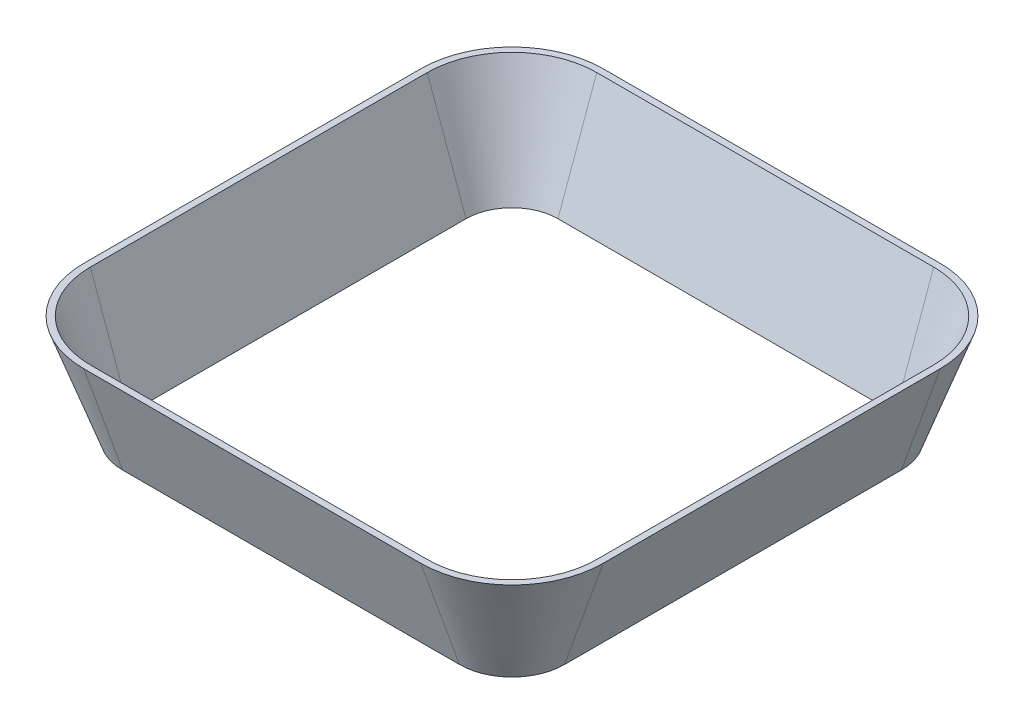
ISO-10303-21;
HEADER;
FILE_DESCRIPTION(('STEP AP214'),'2;1');
FILE_NAME('part.step','',(''),(''),'','','');
FILE_SCHEMA(('AUTOMOTIVE_DESIGN { 1 0 10303 214 1 1 1 1 }'));
ENDSEC;
DATA;
#1=APPLICATION_CONTEXT('core data for automotive mechanical design processes');
#2=APPLICATION_PROTOCOL_DEFINITION('international standard','automotive_design',2000,#1);
#3=PRODUCT_CONTEXT('',#1,'mechanical');
#4=PRODUCT('Part','Part','',(#3));
#5=PRODUCT_RELATED_PRODUCT_CATEGORY('part','',(#4));
#6=PRODUCT_DEFINITION_FORMATION('','',#4);
#7=PRODUCT_DEFINITION_CONTEXT('part definition',#1,'design');
#8=PRODUCT_DEFINITION('design','',#6,#7);
#9=PRODUCT_DEFINITION_SHAPE('','',#8);
#10=(LENGTH_UNIT() NAMED_UNIT(*) SI_UNIT(.MILLI.,.METRE.));
#11=(NAMED_UNIT(*) PLANE_ANGLE_UNIT() SI_UNIT($,.RADIAN.));
#12=(NAMED_UNIT(*) SI_UNIT($,.STERADIAN.) SOLID_ANGLE_UNIT());
#13=UNCERTAINTY_MEASURE_WITH_UNIT(LENGTH_MEASURE(1.E-05),#10,'distance_accuracy_value','');
#14=(GEOMETRIC_REPRESENTATION_CONTEXT(3) GLOBAL_UNCERTAINTY_ASSIGNED_CONTEXT((#13)) GLOBAL_UNIT_ASSIGNED_CONTEXT((#10,
#11,#12)) REPRESENTATION_CONTEXT('',''));
#15=CARTESIAN_POINT('',(0.,0.,0.));
#16=DIRECTION('',(0.,0.,1.));
#17=DIRECTION('',(1.,0.,0.));
#18=AXIS2_PLACEMENT_3D('',#15,#16,#17);
#19=CARTESIAN_POINT('',(-55.,35.,55.));
#20=DIRECTION('',(0.,1.,0.));
#21=DIRECTION('',(0.,0.,1.));
#22=AXIS2_PLACEMENT_3D('',#19,#20,#21);
#23=PLANE('',#22);
#24=CARTESIAN_POINT('',(-55.,35.,55.));
#25=DIRECTION('',(0.,1.,0.));
#26=DIRECTION('',(0.,0.,1.));
#27=AXIS2_PLACEMENT_3D('',#24,#25,#26);
#28=CIRCLE('',#27,27.6729319184893);
#29=CARTESIAN_POINT('',(-82.6729319184893,35.,55.));
#30=VERTEX_POINT('',#29);
#31=CARTESIAN_POINT('',(-55.,35.,82.6729319184893));
#32=VERTEX_POINT('',#31);
#33=EDGE_CURVE('E221',#30,#32,#28,.T.);
#34=ORIENTED_EDGE('',*,*,#33,.F.);
#35=DIRECTION('',(0.,0.,1.));
#36=VECTOR('',#35,1.);
#37=CARTESIAN_POINT('',(-82.6729319184893,35.,0.));
#38=LINE('',#37,#36);
#39=CARTESIAN_POINT('',(-82.6729319184893,35.,-55.0000000000001));
#40=VERTEX_POINT('',#39);
#41=EDGE_CURVE('E206',#40,#30,#38,.T.);
#42=ORIENTED_EDGE('',*,*,#41,.F.);
#43=CARTESIAN_POINT('',(-55.,35.,-55.));
#44=DIRECTION('',(0.,1.,0.));
#45=DIRECTION('',(0.,0.,1.));
#46=AXIS2_PLACEMENT_3D('',#43,#44,#45);
#47=CIRCLE('',#46,27.6729319184893);
#48=CARTESIAN_POINT('',(-55.,35.,-82.6729319184893));
#49=VERTEX_POINT('',#48);
#50=EDGE_CURVE('E105',#49,#40,#47,.T.);
#51=ORIENTED_EDGE('',*,*,#50,.F.);
#52=DIRECTION('',(-1.,0.,0.));
#53=VECTOR('',#52,1.);
#54=CARTESIAN_POINT('',(0.,35.,-82.6729319184893));
#55=LINE('',#54,#53);
#56=CARTESIAN_POINT('',(55.,35.,-82.6729319184893));
#57=VERTEX_POINT('',#56);
#58=EDGE_CURVE('E255',#57,#49,#55,.T.);
#59=ORIENTED_EDGE('',*,*,#58,.F.);
#60=CARTESIAN_POINT('',(55.,35.,-55.));
#61=DIRECTION('',(0.,1.,0.));
#62=DIRECTION('',(0.,0.,1.));
#63=AXIS2_PLACEMENT_3D('',#60,#61,#62);
#64=CIRCLE('',#63,27.6729319184893);
#65=CARTESIAN_POINT('',(82.6729319184893,35.,-55.));
#66=VERTEX_POINT('',#65);
#67=EDGE_CURVE('E251',#66,#57,#64,.T.);
#68=ORIENTED_EDGE('',*,*,#67,.F.);
#69=DIRECTION('',(0.,0.,-1.));
#70=VECTOR('',#69,1.);
#71=CARTESIAN_POINT('',(82.6729319184893,35.,0.));
#72=LINE('',#71,#70);
#73=CARTESIAN_POINT('',(82.6729319184893,35.,55.));
#74=VERTEX_POINT('',#73);
#75=EDGE_CURVE('E247',#74,#66,#72,.T.);
#76=ORIENTED_EDGE('',*,*,#75,.F.);
#77=CARTESIAN_POINT('',(55.,35.,55.));
#78=DIRECTION('',(0.,1.,0.));
#79=DIRECTION('',(0.,0.,1.));
#80=AXIS2_PLACEMENT_3D('',#77,#78,#79);
#81=CIRCLE('',#80,27.6729319184893);
#82=CARTESIAN_POINT('',(55.,35.,82.6729319184893));
#83=VERTEX_POINT('',#82);
#84=EDGE_CURVE('E238',#83,#74,#81,.T.);
#85=ORIENTED_EDGE('',*,*,#84,.F.);
#86=DIRECTION('',(1.,0.,0.));
#87=VECTOR('',#86,1.);
#88=CARTESIAN_POINT('',(0.,35.,82.6729319184893));
#89=LINE('',#88,#87);
#90=EDGE_CURVE('E232',#32,#83,#89,.T.);
#91=ORIENTED_EDGE('',*,*,#90,.F.);
#92=EDGE_LOOP('',(#34,#42,#51,#59,#68,#76,#85,#91));
#93=FACE_BOUND('',#92,.T.);
#94=CARTESIAN_POINT('',(-55.,35.,55.));
#95=DIRECTION('',(0.,1.,0.));
#96=DIRECTION('',(0.,0.,1.));
#97=AXIS2_PLACEMENT_3D('',#94,#95,#96);
#98=CIRCLE('',#97,29.8);
#99=CARTESIAN_POINT('',(-84.8,35.,55.));
#100=VERTEX_POINT('',#99);
#101=CARTESIAN_POINT('',(-55.,35.,84.8));
#102=VERTEX_POINT('',#101);
#103=EDGE_CURVE('E278',#100,#102,#98,.T.);
#104=ORIENTED_EDGE('',*,*,#103,.T.);
#105=DIRECTION('',(1.,0.,0.));
#106=VECTOR('',#105,1.);
#107=CARTESIAN_POINT('',(-55.,35.,84.8));
#108=LINE('',#107,#106);
#109=CARTESIAN_POINT('',(55.,35.,84.8));
#110=VERTEX_POINT('',#109);
#111=EDGE_CURVE('E338',#102,#110,#108,.T.);
#112=ORIENTED_EDGE('',*,*,#111,.T.);
#113=CARTESIAN_POINT('',(55.,35.,55.));
#114=DIRECTION('',(0.,1.,0.));
#115=DIRECTION('',(0.,0.,1.));
#116=AXIS2_PLACEMENT_3D('',#113,#114,#115);
#117=CIRCLE('',#116,29.8);
#118=CARTESIAN_POINT('',(84.8,35.,55.));
#119=VERTEX_POINT('',#118);
#120=EDGE_CURVE('E336',#110,#119,#117,.T.);
#121=ORIENTED_EDGE('',*,*,#120,.T.);
#122=DIRECTION('',(0.,0.,-1.));
#123=VECTOR('',#122,1.);
#124=CARTESIAN_POINT('',(84.8,35.,55.));
#125=LINE('',#124,#123);
#126=CARTESIAN_POINT('',(84.8,35.,-55.));
#127=VERTEX_POINT('',#126);
#128=EDGE_CURVE('E320',#119,#127,#125,.T.);
#129=ORIENTED_EDGE('',*,*,#128,.T.);
#130=CARTESIAN_POINT('',(55.,35.,-55.));
#131=DIRECTION('',(0.,1.,0.));
#132=DIRECTION('',(0.,0.,1.));
#133=AXIS2_PLACEMENT_3D('',#130,#131,#132);
#134=CIRCLE('',#133,29.8);
#135=CARTESIAN_POINT('',(55.,35.,-84.8));
#136=VERTEX_POINT('',#135);
#137=EDGE_CURVE('E309',#127,#136,#134,.T.);
#138=ORIENTED_EDGE('',*,*,#137,.T.);
#139=DIRECTION('',(-1.,0.,0.));
#140=VECTOR('',#139,1.);
#141=CARTESIAN_POINT('',(55.,35.,-84.8));
#142=LINE('',#141,#140);
#143=CARTESIAN_POINT('',(-55.,35.,-84.8));
#144=VERTEX_POINT('',#143);
#145=EDGE_CURVE('E307',#136,#144,#142,.T.);
#146=ORIENTED_EDGE('',*,*,#145,.T.);
#147=CARTESIAN_POINT('',(-55.,35.,-55.));
#148=DIRECTION('',(0.,1.,0.));
#149=DIRECTION('',(0.,0.,1.));
#150=AXIS2_PLACEMENT_3D('',#147,#148,#149);
#151=CIRCLE('',#150,29.8);
#152=CARTESIAN_POINT('',(-84.8,35.,-55.));
#153=VERTEX_POINT('',#152);
#154=EDGE_CURVE('E97',#144,#153,#151,.T.);
#155=ORIENTED_EDGE('',*,*,#154,.T.);
#156=DIRECTION('',(0.,0.,1.));
#157=VECTOR('',#156,1.);
#158=CARTESIAN_POINT('',(-84.8,35.,-55.));
#159=LINE('',#158,#157);
#160=EDGE_CURVE('E13',#153,#100,#159,.T.);
#161=ORIENTED_EDGE('',*,*,#160,.T.);
#162=EDGE_LOOP('',(#104,#112,#121,#129,#138,#146,#155,#161));
#163=FACE_BOUND('',#162,.T.);
#164=ADVANCED_FACE('F86',(#93,#163),#23,.T.);
#165=CARTESIAN_POINT('',(-55.,0.,55.));
#166=DIRECTION('',(0.,1.,0.));
#167=DIRECTION('',(0.,0.,1.));
#168=AXIS2_PLACEMENT_3D('',#165,#166,#167);
#169=PLANE('',#168);
#170=DIRECTION('',(0.,0.,1.));
#171=VECTOR('',#170,1.);
#172=CARTESIAN_POINT('',(-70.,0.,0.));
#173=LINE('',#172,#171);
#174=CARTESIAN_POINT('',(-70.,0.,-55.));
#175=VERTEX_POINT('',#174);
#176=CARTESIAN_POINT('',(-70.,0.,55.));
#177=VERTEX_POINT('',#176);
#178=EDGE_CURVE('E264',#175,#177,#173,.T.);
#179=ORIENTED_EDGE('',*,*,#178,.T.);
#180=CARTESIAN_POINT('',(-55.,0.,55.));
#181=DIRECTION('',(0.,1.,0.));
#182=DIRECTION('',(0.,0.,1.));
#183=AXIS2_PLACEMENT_3D('',#180,#181,#182);
#184=CIRCLE('',#183,15.);
#185=CARTESIAN_POINT('',(-55.,0.,70.));
#186=VERTEX_POINT('',#185);
#187=EDGE_CURVE('E224',#177,#186,#184,.T.);
#188=ORIENTED_EDGE('',*,*,#187,.T.);
#189=DIRECTION('',(1.,0.,0.));
#190=VECTOR('',#189,1.);
#191=CARTESIAN_POINT('',(0.,0.,70.));
#192=LINE('',#191,#190);
#193=CARTESIAN_POINT('',(55.,0.,70.));
#194=VERTEX_POINT('',#193);
#195=EDGE_CURVE('E672',#186,#194,#192,.T.);
#196=ORIENTED_EDGE('',*,*,#195,.T.);
#197=CARTESIAN_POINT('',(55.,0.,55.));
#198=DIRECTION('',(0.,1.,0.));
#199=DIRECTION('',(0.,0.,1.));
#200=AXIS2_PLACEMENT_3D('',#197,#198,#199);
#201=CIRCLE('',#200,15.);
#202=CARTESIAN_POINT('',(70.,0.,55.));
#203=VERTEX_POINT('',#202);
#204=EDGE_CURVE('E676',#194,#203,#201,.T.);
#205=ORIENTED_EDGE('',*,*,#204,.T.);
#206=DIRECTION('',(0.,0.,-1.));
#207=VECTOR('',#206,1.);
#208=CARTESIAN_POINT('',(70.,0.,0.));
#209=LINE('',#208,#207);
#210=CARTESIAN_POINT('',(70.,0.,-55.));
#211=VERTEX_POINT('',#210);
#212=EDGE_CURVE('E681',#203,#211,#209,.T.);
#213=ORIENTED_EDGE('',*,*,#212,.T.);
#214=CARTESIAN_POINT('',(55.,0.,-55.));
#215=DIRECTION('',(0.,1.,0.));
#216=DIRECTION('',(0.,0.,1.));
#217=AXIS2_PLACEMENT_3D('',#214,#215,#216);
#218=CIRCLE('',#217,15.);
#219=CARTESIAN_POINT('',(55.,0.,-70.));
#220=VERTEX_POINT('',#219);
#221=EDGE_CURVE('E685',#211,#220,#218,.T.);
#222=ORIENTED_EDGE('',*,*,#221,.T.);
#223=DIRECTION('',(-1.,0.,0.));
#224=VECTOR('',#223,1.);
#225=CARTESIAN_POINT('',(0.,0.,-70.));
#226=LINE('',#225,#224);
#227=CARTESIAN_POINT('',(-55.,0.,-70.));
#228=VERTEX_POINT('',#227);
#229=EDGE_CURVE('E265',#220,#228,#226,.T.);
#230=ORIENTED_EDGE('',*,*,#229,.T.);
#231=CARTESIAN_POINT('',(-55.,0.,-55.));
#232=DIRECTION('',(0.,1.,0.));
#233=DIRECTION('',(0.,0.,1.));
#234=AXIS2_PLACEMENT_3D('',#231,#232,#233);
#235=CIRCLE('',#234,15.);
#236=EDGE_CURVE('E259',#228,#175,#235,.T.);
#237=ORIENTED_EDGE('',*,*,#236,.T.);
#238=EDGE_LOOP('',(#179,#188,#196,#205,#213,#222,#230,#237));
#239=FACE_BOUND('',#238,.T.);
#240=CARTESIAN_POINT('',(-55.,0.,55.));
#241=DIRECTION('',(0.,1.,0.));
#242=DIRECTION('',(0.,0.,1.));
#243=AXIS2_PLACEMENT_3D('',#240,#241,#242);
#244=CIRCLE('',#243,17.1270680815107);
#245=CARTESIAN_POINT('',(-72.1270680815107,0.,55.));
#246=VERTEX_POINT('',#245);
#247=CARTESIAN_POINT('',(-55.,0.,72.1270680815107));
#248=VERTEX_POINT('',#247);
#249=EDGE_CURVE('E215',#246,#248,#244,.T.);
#250=ORIENTED_EDGE('',*,*,#249,.F.);
#251=DIRECTION('',(0.,0.,1.));
#252=VECTOR('',#251,1.);
#253=CARTESIAN_POINT('',(-72.1270680815107,0.,-55.));
#254=LINE('',#253,#252);
#255=CARTESIAN_POINT('',(-72.1270680815107,0.,-55.));
#256=VERTEX_POINT('',#255);
#257=EDGE_CURVE('E430',#256,#246,#254,.T.);
#258=ORIENTED_EDGE('',*,*,#257,.F.);
#259=CARTESIAN_POINT('',(-55.,0.,-55.));
#260=DIRECTION('',(0.,1.,0.));
#261=DIRECTION('',(0.,0.,1.));
#262=AXIS2_PLACEMENT_3D('',#259,#260,#261);
#263=CIRCLE('',#262,17.1270680815107);
#264=CARTESIAN_POINT('',(-55.,0.,-72.1270680815107));
#265=VERTEX_POINT('',#264);
#266=EDGE_CURVE('E436',#265,#256,#263,.T.);
#267=ORIENTED_EDGE('',*,*,#266,.F.);
#268=DIRECTION('',(-1.,0.,0.));
#269=VECTOR('',#268,1.);
#270=CARTESIAN_POINT('',(55.,0.,-72.1270680815107));
#271=LINE('',#270,#269);
#272=CARTESIAN_POINT('',(55.,0.,-72.1270680815107));
#273=VERTEX_POINT('',#272);
#274=EDGE_CURVE('E380',#273,#265,#271,.T.);
#275=ORIENTED_EDGE('',*,*,#274,.F.);
#276=CARTESIAN_POINT('',(55.,0.,-55.));
#277=DIRECTION('',(0.,1.,0.));
#278=DIRECTION('',(0.,0.,1.));
#279=AXIS2_PLACEMENT_3D('',#276,#277,#278);
#280=CIRCLE('',#279,17.1270680815107);
#281=CARTESIAN_POINT('',(72.1270680815107,0.,-55.));
#282=VERTEX_POINT('',#281);
#283=EDGE_CURVE('E513',#282,#273,#280,.T.);
#284=ORIENTED_EDGE('',*,*,#283,.F.);
#285=DIRECTION('',(0.,0.,-1.));
#286=VECTOR('',#285,1.);
#287=CARTESIAN_POINT('',(72.1270680815107,0.,55.));
#288=LINE('',#287,#286);
#289=CARTESIAN_POINT('',(72.1270680815107,0.,55.));
#290=VERTEX_POINT('',#289);
#291=EDGE_CURVE('E508',#290,#282,#288,.T.);
#292=ORIENTED_EDGE('',*,*,#291,.F.);
#293=CARTESIAN_POINT('',(55.,0.,55.));
#294=DIRECTION('',(0.,1.,0.));
#295=DIRECTION('',(0.,0.,1.));
#296=AXIS2_PLACEMENT_3D('',#293,#294,#295);
#297=CIRCLE('',#296,17.1270680815107);
#298=CARTESIAN_POINT('',(55.,0.,72.1270680815107));
#299=VERTEX_POINT('',#298);
#300=EDGE_CURVE('E503',#299,#290,#297,.T.);
#301=ORIENTED_EDGE('',*,*,#300,.F.);
#302=DIRECTION('',(1.,0.,0.));
#303=VECTOR('',#302,1.);
#304=CARTESIAN_POINT('',(-55.,0.,72.1270680815107));
#305=LINE('',#304,#303);
#306=EDGE_CURVE('E495',#248,#299,#305,.T.);
#307=ORIENTED_EDGE('',*,*,#306,.F.);
#308=EDGE_LOOP('',(#250,#258,#267,#275,#284,#292,#301,#307));
#309=FACE_BOUND('',#308,.T.);
#310=ADVANCED_FACE('F447',(#239,#309),#169,.F.);
#311=CARTESIAN_POINT('',(-55.,0.,-55.));
#312=DIRECTION('',(0.,1.,0.));
#313=DIRECTION('',(0.,0.,1.));
#314=AXIS2_PLACEMENT_3D('',#311,#312,#313);
#315=CONICAL_SURFACE('',#314,17.1270680815107,0.347399050701601);
#316=DIRECTION('',(-0.340453389571364,0.940261394256602,0.));
#317=VECTOR('',#316,1.);
#318=CARTESIAN_POINT('',(-72.1270680815107,0.,-55.));
#319=LINE('',#318,#317);
#320=EDGE_CURVE('E435',#256,#153,#319,.T.);
#321=ORIENTED_EDGE('',*,*,#320,.T.);
#322=ORIENTED_EDGE('',*,*,#154,.F.);
#323=DIRECTION('',(0.,0.940261394256602,-0.340453389571364));
#324=VECTOR('',#323,1.);
#325=CARTESIAN_POINT('',(-55.,0.,-72.1270680815107));
#326=LINE('',#325,#324);
#327=EDGE_CURVE('E386',#265,#144,#326,.T.);
#328=ORIENTED_EDGE('',*,*,#327,.F.);
#329=ORIENTED_EDGE('',*,*,#266,.T.);
#330=EDGE_LOOP('',(#321,#322,#328,#329));
#331=FACE_BOUND('',#330,.T.);
#332=ADVANCED_FACE('F399',(#331),#315,.T.);
#333=CARTESIAN_POINT('',(0.,-23.0889692921857,-63.766927055569));
#334=DIRECTION('',(0.,0.340453389571364,0.940261394256602));
#335=DIRECTION('',(0.,-0.940261394256602,0.340453389571364));
#336=AXIS2_PLACEMENT_3D('',#333,#334,#335);
#337=PLANE('',#336);
#338=ORIENTED_EDGE('',*,*,#327,.T.);
#339=ORIENTED_EDGE('',*,*,#145,.F.);
#340=DIRECTION('',(0.,0.940261394256602,-0.340453389571364));
#341=VECTOR('',#340,1.);
#342=CARTESIAN_POINT('',(55.,0.,-72.1270680815107));
#343=LINE('',#342,#341);
#344=EDGE_CURVE('E358',#273,#136,#343,.T.);
#345=ORIENTED_EDGE('',*,*,#344,.F.);
#346=ORIENTED_EDGE('',*,*,#274,.T.);
#347=EDGE_LOOP('',(#338,#339,#345,#346));
#348=FACE_BOUND('',#347,.T.);
#349=ADVANCED_FACE('F388',(#348),#337,.F.);
#350=CARTESIAN_POINT('',(-63.766927055569,-23.0889692921857,0.));
#351=DIRECTION('',(0.940261394256602,0.340453389571364,0.));
#352=DIRECTION('',(-0.340453389571364,0.940261394256602,0.));
#353=AXIS2_PLACEMENT_3D('',#350,#351,#352);
#354=PLANE('',#353);
#355=DIRECTION('',(-0.340453389571364,0.940261394256602,0.));
#356=VECTOR('',#355,1.);
#357=CARTESIAN_POINT('',(-72.1270680815107,0.,55.));
#358=LINE('',#357,#356);
#359=EDGE_CURVE('E594',#246,#100,#358,.T.);
#360=ORIENTED_EDGE('',*,*,#359,.T.);
#361=ORIENTED_EDGE('',*,*,#160,.F.);
#362=ORIENTED_EDGE('',*,*,#320,.F.);
#363=ORIENTED_EDGE('',*,*,#257,.T.);
#364=EDGE_LOOP('',(#360,#361,#362,#363));
#365=FACE_BOUND('',#364,.T.);
#366=ADVANCED_FACE('F398',(#365),#354,.F.);
#367=CARTESIAN_POINT('',(-55.,0.,55.));
#368=DIRECTION('',(0.,1.,0.));
#369=DIRECTION('',(0.,0.,1.));
#370=AXIS2_PLACEMENT_3D('',#367,#368,#369);
#371=CONICAL_SURFACE('',#370,17.1270680815107,0.347399050701601);
#372=DIRECTION('',(0.,0.940261394256602,0.340453389571364));
#373=VECTOR('',#372,1.);
#374=CARTESIAN_POINT('',(-55.,0.,72.1270680815107));
#375=LINE('',#374,#373);
#376=EDGE_CURVE('E589',#248,#102,#375,.T.);
#377=ORIENTED_EDGE('',*,*,#376,.T.);
#378=ORIENTED_EDGE('',*,*,#103,.F.);
#379=ORIENTED_EDGE('',*,*,#359,.F.);
#380=ORIENTED_EDGE('',*,*,#249,.T.);
#381=EDGE_LOOP('',(#377,#378,#379,#380));
#382=FACE_BOUND('',#381,.T.);
#383=ADVANCED_FACE('F616',(#382),#371,.T.);
#384=CARTESIAN_POINT('',(0.,-23.0889692921857,63.766927055569));
#385=DIRECTION('',(0.,0.340453389571364,-0.940261394256602));
#386=DIRECTION('',(0.,0.940261394256602,0.340453389571364));
#387=AXIS2_PLACEMENT_3D('',#384,#385,#386);
#388=PLANE('',#387);
#389=DIRECTION('',(0.,0.940261394256602,0.340453389571364));
#390=VECTOR('',#389,1.);
#391=CARTESIAN_POINT('',(55.,0.,72.1270680815107));
#392=LINE('',#391,#390);
#393=EDGE_CURVE('E587',#299,#110,#392,.T.);
#394=ORIENTED_EDGE('',*,*,#393,.T.);
#395=ORIENTED_EDGE('',*,*,#111,.F.);
#396=ORIENTED_EDGE('',*,*,#376,.F.);
#397=ORIENTED_EDGE('',*,*,#306,.T.);
#398=EDGE_LOOP('',(#394,#395,#396,#397));
#399=FACE_BOUND('',#398,.T.);
#400=ADVANCED_FACE('F563',(#399),#388,.F.);
#401=CARTESIAN_POINT('',(55.,0.,55.));
#402=DIRECTION('',(0.,1.,0.));
#403=DIRECTION('',(0.,0.,1.));
#404=AXIS2_PLACEMENT_3D('',#401,#402,#403);
#405=CONICAL_SURFACE('',#404,17.1270680815107,0.347399050701601);
#406=DIRECTION('',(0.340453389571364,0.940261394256602,0.));
#407=VECTOR('',#406,1.);
#408=CARTESIAN_POINT('',(72.1270680815107,0.,55.));
#409=LINE('',#408,#407);
#410=EDGE_CURVE('E368',#290,#119,#409,.T.);
#411=ORIENTED_EDGE('',*,*,#410,.T.);
#412=ORIENTED_EDGE('',*,*,#120,.F.);
#413=ORIENTED_EDGE('',*,*,#393,.F.);
#414=ORIENTED_EDGE('',*,*,#300,.T.);
#415=EDGE_LOOP('',(#411,#412,#413,#414));
#416=FACE_BOUND('',#415,.T.);
#417=ADVANCED_FACE('F549',(#416),#405,.T.);
#418=CARTESIAN_POINT('',(63.766927055569,-23.0889692921857,0.));
#419=DIRECTION('',(-0.940261394256602,0.340453389571364,0.));
#420=DIRECTION('',(-0.340453389571364,-0.940261394256602,0.));
#421=AXIS2_PLACEMENT_3D('',#418,#419,#420);
#422=PLANE('',#421);
#423=DIRECTION('',(0.340453389571364,0.940261394256602,0.));
#424=VECTOR('',#423,1.);
#425=CARTESIAN_POINT('',(72.1270680815107,0.,-55.));
#426=LINE('',#425,#424);
#427=EDGE_CURVE('E360',#282,#127,#426,.T.);
#428=ORIENTED_EDGE('',*,*,#427,.T.);
#429=ORIENTED_EDGE('',*,*,#128,.F.);
#430=ORIENTED_EDGE('',*,*,#410,.F.);
#431=ORIENTED_EDGE('',*,*,#291,.T.);
#432=EDGE_LOOP('',(#428,#429,#430,#431));
#433=FACE_BOUND('',#432,.T.);
#434=ADVANCED_FACE('F524',(#433),#422,.F.);
#435=CARTESIAN_POINT('',(55.,0.,-55.));
#436=DIRECTION('',(0.,1.,0.));
#437=DIRECTION('',(0.,0.,1.));
#438=AXIS2_PLACEMENT_3D('',#435,#436,#437);
#439=CONICAL_SURFACE('',#438,17.1270680815107,0.347399050701601);
#440=ORIENTED_EDGE('',*,*,#344,.T.);
#441=ORIENTED_EDGE('',*,*,#137,.F.);
#442=ORIENTED_EDGE('',*,*,#427,.F.);
#443=ORIENTED_EDGE('',*,*,#283,.T.);
#444=EDGE_LOOP('',(#440,#441,#442,#443));
#445=FACE_BOUND('',#444,.T.);
#446=ADVANCED_FACE('F528',(#445),#439,.T.);
#447=CARTESIAN_POINT('',(-55.,0.680906779142727,-55.));
#448=DIRECTION('',(0.,1.,0.));
#449=DIRECTION('',(0.,0.,1.));
#450=AXIS2_PLACEMENT_3D('',#447,#448,#449);
#451=CONICAL_SURFACE('',#450,15.2465452929975,0.347399050701601);
#452=DIRECTION('',(-0.340453389571364,0.940261394256602,0.));
#453=VECTOR('',#452,1.);
#454=CARTESIAN_POINT('',(-70.2465452929975,0.680906779142727,-55.));
#455=LINE('',#454,#453);
#456=EDGE_CURVE('E211',#175,#40,#455,.T.);
#457=ORIENTED_EDGE('',*,*,#456,.F.);
#458=ORIENTED_EDGE('',*,*,#236,.F.);
#459=DIRECTION('',(0.,-0.940261394256602,0.340453389571364));
#460=VECTOR('',#459,1.);
#461=CARTESIAN_POINT('',(-55.,-22.4080625130429,-61.8864042670559));
#462=LINE('',#461,#460);
#463=EDGE_CURVE('E228',#228,#49,#462,.F.);
#464=ORIENTED_EDGE('',*,*,#463,.T.);
#465=ORIENTED_EDGE('',*,*,#50,.T.);
#466=EDGE_LOOP('',(#457,#458,#464,#465));
#467=FACE_BOUND('',#466,.T.);
#468=ADVANCED_FACE('F544',(#467),#451,.F.);
#469=CARTESIAN_POINT('',(0.,-22.4080625130429,-61.8864042670559));
#470=DIRECTION('',(0.,0.340453389571364,0.940261394256602));
#471=DIRECTION('',(0.,-0.940261394256602,0.340453389571364));
#472=AXIS2_PLACEMENT_3D('',#469,#470,#471);
#473=PLANE('',#472);
#474=ORIENTED_EDGE('',*,*,#463,.F.);
#475=ORIENTED_EDGE('',*,*,#229,.F.);
#476=DIRECTION('',(0.,0.940261394256602,-0.340453389571364));
#477=VECTOR('',#476,1.);
#478=CARTESIAN_POINT('',(55.,0.680906779142727,-70.2465452929975));
#479=LINE('',#478,#477);
#480=EDGE_CURVE('E234',#220,#57,#479,.T.);
#481=ORIENTED_EDGE('',*,*,#480,.T.);
#482=ORIENTED_EDGE('',*,*,#58,.T.);
#483=EDGE_LOOP('',(#474,#475,#481,#482));
#484=FACE_BOUND('',#483,.T.);
#485=ADVANCED_FACE('F695',(#484),#473,.T.);
#486=CARTESIAN_POINT('',(-61.8864042670559,-22.4080625130429,0.));
#487=DIRECTION('',(0.940261394256602,0.340453389571364,0.));
#488=DIRECTION('',(-0.340453389571364,0.940261394256602,0.));
#489=AXIS2_PLACEMENT_3D('',#486,#487,#488);
#490=PLANE('',#489);
#491=DIRECTION('',(-0.340453389571364,0.940261394256602,0.));
#492=VECTOR('',#491,1.);
#493=CARTESIAN_POINT('',(-61.8864042670559,-22.4080625130429,55.));
#494=LINE('',#493,#492);
#495=EDGE_CURVE('E209',#177,#30,#494,.T.);
#496=ORIENTED_EDGE('',*,*,#495,.F.);
#497=ORIENTED_EDGE('',*,*,#178,.F.);
#498=ORIENTED_EDGE('',*,*,#456,.T.);
#499=ORIENTED_EDGE('',*,*,#41,.T.);
#500=EDGE_LOOP('',(#496,#497,#498,#499));
#501=FACE_BOUND('',#500,.T.);
#502=ADVANCED_FACE('F208',(#501),#490,.T.);
#503=CARTESIAN_POINT('',(-55.,0.680906779142727,55.));
#504=DIRECTION('',(0.,1.,0.));
#505=DIRECTION('',(0.,0.,1.));
#506=AXIS2_PLACEMENT_3D('',#503,#504,#505);
#507=CONICAL_SURFACE('',#506,15.2465452929975,0.347399050701601);
#508=DIRECTION('',(0.,0.940261394256602,0.340453389571364));
#509=VECTOR('',#508,1.);
#510=CARTESIAN_POINT('',(-55.,0.680906779142727,70.2465452929975));
#511=LINE('',#510,#509);
#512=EDGE_CURVE('E227',#186,#32,#511,.T.);
#513=ORIENTED_EDGE('',*,*,#512,.F.);
#514=ORIENTED_EDGE('',*,*,#187,.F.);
#515=ORIENTED_EDGE('',*,*,#495,.T.);
#516=ORIENTED_EDGE('',*,*,#33,.T.);
#517=EDGE_LOOP('',(#513,#514,#515,#516));
#518=FACE_BOUND('',#517,.T.);
#519=ADVANCED_FACE('F220',(#518),#507,.F.);
#520=CARTESIAN_POINT('',(0.,-22.4080625130429,61.8864042670559));
#521=DIRECTION('',(0.,0.340453389571364,-0.940261394256602));
#522=DIRECTION('',(0.,0.940261394256602,0.340453389571364));
#523=AXIS2_PLACEMENT_3D('',#520,#521,#522);
#524=PLANE('',#523);
#525=DIRECTION('',(0.,0.940261394256602,0.340453389571364));
#526=VECTOR('',#525,1.);
#527=CARTESIAN_POINT('',(55.,-22.4080625130429,61.8864042670559));
#528=LINE('',#527,#526);
#529=EDGE_CURVE('E113',#194,#83,#528,.T.);
#530=ORIENTED_EDGE('',*,*,#529,.F.);
#531=ORIENTED_EDGE('',*,*,#195,.F.);
#532=ORIENTED_EDGE('',*,*,#512,.T.);
#533=ORIENTED_EDGE('',*,*,#90,.T.);
#534=EDGE_LOOP('',(#530,#531,#532,#533));
#535=FACE_BOUND('',#534,.T.);
#536=ADVANCED_FACE('F706',(#535),#524,.T.);
#537=CARTESIAN_POINT('',(55.,0.680906779142727,55.));
#538=DIRECTION('',(0.,1.,0.));
#539=DIRECTION('',(0.,0.,1.));
#540=AXIS2_PLACEMENT_3D('',#537,#538,#539);
#541=CONICAL_SURFACE('',#540,15.2465452929975,0.347399050701601);
#542=DIRECTION('',(0.340453389571364,0.940261394256602,0.));
#543=VECTOR('',#542,1.);
#544=CARTESIAN_POINT('',(70.2465452929975,0.680906779142727,55.));
#545=LINE('',#544,#543);
#546=EDGE_CURVE('E649',#203,#74,#545,.T.);
#547=ORIENTED_EDGE('',*,*,#546,.F.);
#548=ORIENTED_EDGE('',*,*,#204,.F.);
#549=ORIENTED_EDGE('',*,*,#529,.T.);
#550=ORIENTED_EDGE('',*,*,#84,.T.);
#551=EDGE_LOOP('',(#547,#548,#549,#550));
#552=FACE_BOUND('',#551,.T.);
#553=ADVANCED_FACE('F705',(#552),#541,.F.);
#554=CARTESIAN_POINT('',(61.8864042670559,-22.4080625130429,0.));
#555=DIRECTION('',(-0.940261394256602,0.340453389571364,0.));
#556=DIRECTION('',(-0.340453389571364,-0.940261394256602,0.));
#557=AXIS2_PLACEMENT_3D('',#554,#555,#556);
#558=PLANE('',#557);
#559=DIRECTION('',(-0.340453389571364,-0.940261394256602,0.));
#560=VECTOR('',#559,1.);
#561=CARTESIAN_POINT('',(61.8864042670559,-22.4080625130429,-55.));
#562=LINE('',#561,#560);
#563=EDGE_CURVE('E240',#211,#66,#562,.F.);
#564=ORIENTED_EDGE('',*,*,#563,.F.);
#565=ORIENTED_EDGE('',*,*,#212,.F.);
#566=ORIENTED_EDGE('',*,*,#546,.T.);
#567=ORIENTED_EDGE('',*,*,#75,.T.);
#568=EDGE_LOOP('',(#564,#565,#566,#567));
#569=FACE_BOUND('',#568,.T.);
#570=ADVANCED_FACE('F702',(#569),#558,.T.);
#571=CARTESIAN_POINT('',(55.,0.680906779142727,-55.));
#572=DIRECTION('',(0.,1.,0.));
#573=DIRECTION('',(0.,0.,1.));
#574=AXIS2_PLACEMENT_3D('',#571,#572,#573);
#575=CONICAL_SURFACE('',#574,15.2465452929975,0.347399050701601);
#576=ORIENTED_EDGE('',*,*,#480,.F.);
#577=ORIENTED_EDGE('',*,*,#221,.F.);
#578=ORIENTED_EDGE('',*,*,#563,.T.);
#579=ORIENTED_EDGE('',*,*,#67,.T.);
#580=EDGE_LOOP('',(#576,#577,#578,#579));
#581=FACE_BOUND('',#580,.T.);
#582=ADVANCED_FACE('F457',(#581),#575,.F.);
#583=CLOSED_SHELL('',(#164,#310,#332,#349,#366,#383,#400,#417,#434,#446,#468,#485,#502,#519,
#536,#553,#570,#582));
#584=MANIFOLD_SOLID_BREP('B2',#583);
#585=ADVANCED_BREP_SHAPE_REPRESENTATION('',(#18,#584),#14);
#586=SHAPE_DEFINITION_REPRESENTATION(#9,#585);
ENDSEC;
END-ISO-10303-21;
